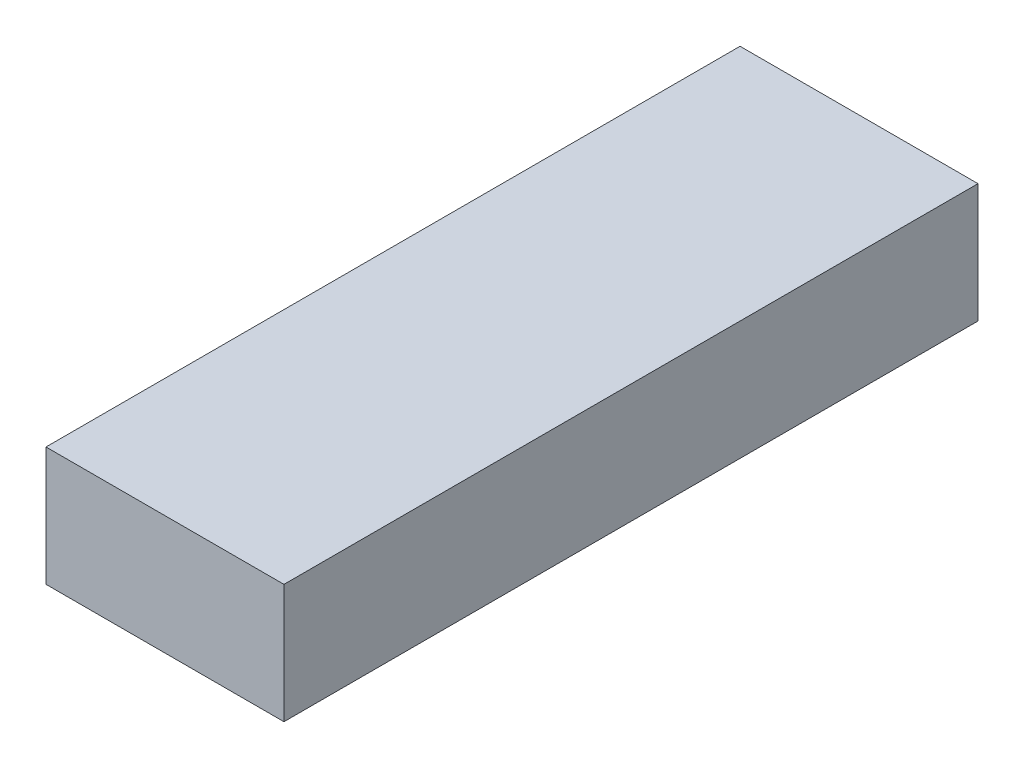
ISO-10303-21;
HEADER;
FILE_DESCRIPTION(('STEP AP214'),'2;1');
FILE_NAME('part.step','',(''),(''),'','','');
FILE_SCHEMA(('AUTOMOTIVE_DESIGN { 1 0 10303 214 1 1 1 1 }'));
ENDSEC;
DATA;
#1=APPLICATION_CONTEXT('core data for automotive mechanical design processes');
#2=APPLICATION_PROTOCOL_DEFINITION('international standard','automotive_design',2000,#1);
#3=PRODUCT_CONTEXT('',#1,'mechanical');
#4=PRODUCT('Part','Part','',(#3));
#5=PRODUCT_RELATED_PRODUCT_CATEGORY('part','',(#4));
#6=PRODUCT_DEFINITION_FORMATION('','',#4);
#7=PRODUCT_DEFINITION_CONTEXT('part definition',#1,'design');
#8=PRODUCT_DEFINITION('design','',#6,#7);
#9=PRODUCT_DEFINITION_SHAPE('','',#8);
#10=(LENGTH_UNIT() NAMED_UNIT(*) SI_UNIT(.MILLI.,.METRE.));
#11=(NAMED_UNIT(*) PLANE_ANGLE_UNIT() SI_UNIT($,.RADIAN.));
#12=(NAMED_UNIT(*) SI_UNIT($,.STERADIAN.) SOLID_ANGLE_UNIT());
#13=UNCERTAINTY_MEASURE_WITH_UNIT(LENGTH_MEASURE(1.E-05),#10,'distance_accuracy_value','');
#14=(GEOMETRIC_REPRESENTATION_CONTEXT(3) GLOBAL_UNCERTAINTY_ASSIGNED_CONTEXT((#13)) GLOBAL_UNIT_ASSIGNED_CONTEXT((#10,
#11,#12)) REPRESENTATION_CONTEXT('',''));
#15=CARTESIAN_POINT('',(0.,0.,0.));
#16=DIRECTION('',(0.,0.,1.));
#17=DIRECTION('',(1.,0.,0.));
#18=AXIS2_PLACEMENT_3D('',#15,#16,#17);
#19=CARTESIAN_POINT('',(-7.91243421052733,5.06689173642795,44.45));
#20=DIRECTION('',(1.,0.,0.));
#21=DIRECTION('',(0.,0.,-1.));
#22=AXIS2_PLACEMENT_3D('',#19,#20,#21);
#23=PLANE('',#22);
#24=DIRECTION('',(0.,-1.,0.));
#25=VECTOR('',#24,1.);
#26=CARTESIAN_POINT('',(-7.91243421052733,5.06689173642795,0.));
#27=LINE('',#26,#25);
#28=CARTESIAN_POINT('',(-7.91243421052733,5.06689173642795,0.));
#29=VERTEX_POINT('',#28);
#30=CARTESIAN_POINT('',(-7.91243421052733,-2.55310826357205,0.));
#31=VERTEX_POINT('',#30);
#32=EDGE_CURVE('E96',#29,#31,#27,.T.);
#33=ORIENTED_EDGE('',*,*,#32,.T.);
#34=DIRECTION('',(0.,0.,-1.));
#35=VECTOR('',#34,1.);
#36=CARTESIAN_POINT('',(-7.91243421052733,-2.55310826357205,44.45));
#37=LINE('',#36,#35);
#38=CARTESIAN_POINT('',(-7.91243421052733,-2.55310826357205,44.45));
#39=VERTEX_POINT('',#38);
#40=EDGE_CURVE('E11',#39,#31,#37,.T.);
#41=ORIENTED_EDGE('',*,*,#40,.F.);
#42=DIRECTION('',(0.,-1.,0.));
#43=VECTOR('',#42,1.);
#44=CARTESIAN_POINT('',(-7.91243421052733,5.06689173642795,44.45));
#45=LINE('',#44,#43);
#46=CARTESIAN_POINT('',(-7.91243421052733,5.06689173642795,44.45));
#47=VERTEX_POINT('',#46);
#48=EDGE_CURVE('E84',#47,#39,#45,.T.);
#49=ORIENTED_EDGE('',*,*,#48,.F.);
#50=DIRECTION('',(0.,0.,-1.));
#51=VECTOR('',#50,1.);
#52=CARTESIAN_POINT('',(-7.91243421052733,5.06689173642795,44.45));
#53=LINE('',#52,#51);
#54=EDGE_CURVE('E92',#47,#29,#53,.T.);
#55=ORIENTED_EDGE('',*,*,#54,.T.);
#56=EDGE_LOOP('',(#33,#41,#49,#55));
#57=FACE_BOUND('',#56,.T.);
#58=ADVANCED_FACE('F33',(#57),#23,.F.);
#59=CARTESIAN_POINT('',(-7.91243421052733,-2.55310826357205,44.45));
#60=DIRECTION('',(0.,1.,0.));
#61=DIRECTION('',(0.,0.,1.));
#62=AXIS2_PLACEMENT_3D('',#59,#60,#61);
#63=PLANE('',#62);
#64=DIRECTION('',(1.,0.,0.));
#65=VECTOR('',#64,1.);
#66=CARTESIAN_POINT('',(-7.91243421052733,-2.55310826357205,0.));
#67=LINE('',#66,#65);
#68=CARTESIAN_POINT('',(7.32756578947267,-2.55310826357205,0.));
#69=VERTEX_POINT('',#68);
#70=EDGE_CURVE('E88',#31,#69,#67,.T.);
#71=ORIENTED_EDGE('',*,*,#70,.T.);
#72=DIRECTION('',(0.,0.,-1.));
#73=VECTOR('',#72,1.);
#74=CARTESIAN_POINT('',(7.32756578947267,-2.55310826357205,44.45));
#75=LINE('',#74,#73);
#76=CARTESIAN_POINT('',(7.32756578947267,-2.55310826357205,44.45));
#77=VERTEX_POINT('',#76);
#78=EDGE_CURVE('E41',#77,#69,#75,.T.);
#79=ORIENTED_EDGE('',*,*,#78,.F.);
#80=DIRECTION('',(1.,0.,0.));
#81=VECTOR('',#80,1.);
#82=CARTESIAN_POINT('',(-7.91243421052733,-2.55310826357205,44.45));
#83=LINE('',#82,#81);
#84=EDGE_CURVE('E79',#39,#77,#83,.T.);
#85=ORIENTED_EDGE('',*,*,#84,.F.);
#86=ORIENTED_EDGE('',*,*,#40,.T.);
#87=EDGE_LOOP('',(#71,#79,#85,#86));
#88=FACE_BOUND('',#87,.T.);
#89=ADVANCED_FACE('F87',(#88),#63,.F.);
#90=CARTESIAN_POINT('',(7.32756578947267,5.06689173642795,44.45));
#91=DIRECTION('',(-1.,0.,0.));
#92=DIRECTION('',(0.,-1.,0.));
#93=AXIS2_PLACEMENT_3D('',#90,#91,#92);
#94=PLANE('',#93);
#95=DIRECTION('',(0.,1.,0.));
#96=VECTOR('',#95,1.);
#97=CARTESIAN_POINT('',(7.32756578947267,5.06689173642795,0.));
#98=LINE('',#97,#96);
#99=CARTESIAN_POINT('',(7.32756578947267,5.06689173642795,0.));
#100=VERTEX_POINT('',#99);
#101=EDGE_CURVE('E66',#69,#100,#98,.T.);
#102=ORIENTED_EDGE('',*,*,#101,.T.);
#103=DIRECTION('',(0.,0.,-1.));
#104=VECTOR('',#103,1.);
#105=CARTESIAN_POINT('',(7.32756578947267,5.06689173642795,44.45));
#106=LINE('',#105,#104);
#107=CARTESIAN_POINT('',(7.32756578947267,5.06689173642795,44.45));
#108=VERTEX_POINT('',#107);
#109=EDGE_CURVE('E89',#108,#100,#106,.T.);
#110=ORIENTED_EDGE('',*,*,#109,.F.);
#111=DIRECTION('',(0.,1.,0.));
#112=VECTOR('',#111,1.);
#113=CARTESIAN_POINT('',(7.32756578947267,5.06689173642795,44.45));
#114=LINE('',#113,#112);
#115=EDGE_CURVE('E82',#77,#108,#114,.T.);
#116=ORIENTED_EDGE('',*,*,#115,.F.);
#117=ORIENTED_EDGE('',*,*,#78,.T.);
#118=EDGE_LOOP('',(#102,#110,#116,#117));
#119=FACE_BOUND('',#118,.T.);
#120=ADVANCED_FACE('F90',(#119),#94,.F.);
#121=CARTESIAN_POINT('',(-7.91243421052733,5.06689173642795,44.45));
#122=DIRECTION('',(0.,-1.,0.));
#123=DIRECTION('',(0.,0.,-1.));
#124=AXIS2_PLACEMENT_3D('',#121,#122,#123);
#125=PLANE('',#124);
#126=DIRECTION('',(-1.,0.,0.));
#127=VECTOR('',#126,1.);
#128=CARTESIAN_POINT('',(-7.91243421052733,5.06689173642795,0.));
#129=LINE('',#128,#127);
#130=EDGE_CURVE('E72',#100,#29,#129,.T.);
#131=ORIENTED_EDGE('',*,*,#130,.T.);
#132=ORIENTED_EDGE('',*,*,#54,.F.);
#133=DIRECTION('',(-1.,0.,0.));
#134=VECTOR('',#133,1.);
#135=CARTESIAN_POINT('',(-7.91243421052733,5.06689173642795,44.45));
#136=LINE('',#135,#134);
#137=EDGE_CURVE('E49',#108,#47,#136,.T.);
#138=ORIENTED_EDGE('',*,*,#137,.F.);
#139=ORIENTED_EDGE('',*,*,#109,.T.);
#140=EDGE_LOOP('',(#131,#132,#138,#139));
#141=FACE_BOUND('',#140,.T.);
#142=ADVANCED_FACE('F103',(#141),#125,.F.);
#143=CARTESIAN_POINT('',(0.,0.,44.45));
#144=DIRECTION('',(0.,0.,1.));
#145=DIRECTION('',(1.,0.,0.));
#146=AXIS2_PLACEMENT_3D('',#143,#144,#145);
#147=PLANE('',#146);
#148=ORIENTED_EDGE('',*,*,#48,.T.);
#149=ORIENTED_EDGE('',*,*,#84,.T.);
#150=ORIENTED_EDGE('',*,*,#115,.T.);
#151=ORIENTED_EDGE('',*,*,#137,.T.);
#152=EDGE_LOOP('',(#148,#149,#150,#151));
#153=FACE_BOUND('',#152,.T.);
#154=ADVANCED_FACE('F80',(#153),#147,.T.);
#155=CARTESIAN_POINT('',(0.,0.,0.));
#156=DIRECTION('',(0.,0.,1.));
#157=DIRECTION('',(1.,0.,0.));
#158=AXIS2_PLACEMENT_3D('',#155,#156,#157);
#159=PLANE('',#158);
#160=ORIENTED_EDGE('',*,*,#32,.F.);
#161=ORIENTED_EDGE('',*,*,#130,.F.);
#162=ORIENTED_EDGE('',*,*,#101,.F.);
#163=ORIENTED_EDGE('',*,*,#70,.F.);
#164=EDGE_LOOP('',(#160,#161,#162,#163));
#165=FACE_BOUND('',#164,.T.);
#166=ADVANCED_FACE('F106',(#165),#159,.F.);
#167=CLOSED_SHELL('',(#58,#89,#120,#142,#154,#166));
#168=MANIFOLD_SOLID_BREP('B2',#167);
#169=ADVANCED_BREP_SHAPE_REPRESENTATION('',(#18,#168),#14);
#170=SHAPE_DEFINITION_REPRESENTATION(#9,#169);
ENDSEC;
END-ISO-10303-21;
